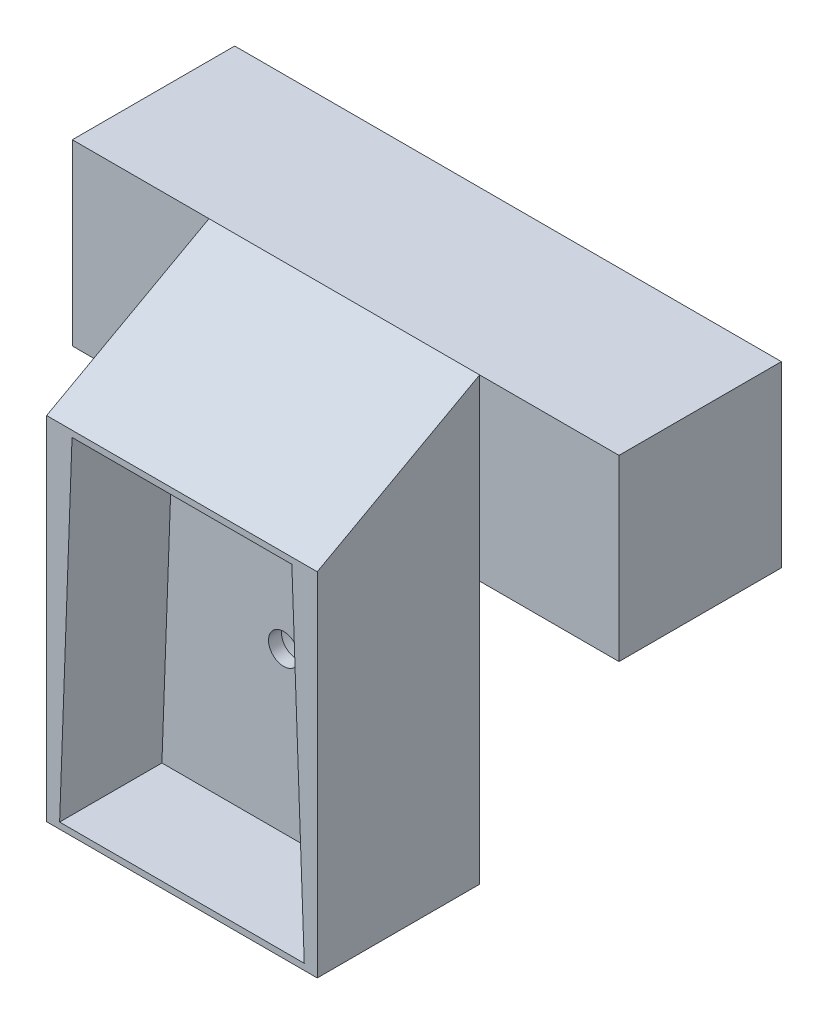
ISO-10303-21;
HEADER;
FILE_DESCRIPTION(('STEP AP214'),'2;1');
FILE_NAME('part.step','',(''),(''),'','','');
FILE_SCHEMA(('AUTOMOTIVE_DESIGN { 1 0 10303 214 1 1 1 1 }'));
ENDSEC;
DATA;
#1=APPLICATION_CONTEXT('core data for automotive mechanical design processes');
#2=APPLICATION_PROTOCOL_DEFINITION('international standard','automotive_design',2000,#1);
#3=PRODUCT_CONTEXT('',#1,'mechanical');
#4=PRODUCT('Part','Part','',(#3));
#5=PRODUCT_RELATED_PRODUCT_CATEGORY('part','',(#4));
#6=PRODUCT_DEFINITION_FORMATION('','',#4);
#7=PRODUCT_DEFINITION_CONTEXT('part definition',#1,'design');
#8=PRODUCT_DEFINITION('design','',#6,#7);
#9=PRODUCT_DEFINITION_SHAPE('','',#8);
#10=(LENGTH_UNIT() NAMED_UNIT(*) SI_UNIT(.MILLI.,.METRE.));
#11=(NAMED_UNIT(*) PLANE_ANGLE_UNIT() SI_UNIT($,.RADIAN.));
#12=(NAMED_UNIT(*) SI_UNIT($,.STERADIAN.) SOLID_ANGLE_UNIT());
#13=UNCERTAINTY_MEASURE_WITH_UNIT(LENGTH_MEASURE(1.E-05),#10,'distance_accuracy_value','');
#14=(GEOMETRIC_REPRESENTATION_CONTEXT(3) GLOBAL_UNCERTAINTY_ASSIGNED_CONTEXT((#13)) GLOBAL_UNIT_ASSIGNED_CONTEXT((#10,
#11,#12)) REPRESENTATION_CONTEXT('',''));
#15=CARTESIAN_POINT('',(0.,0.,0.));
#16=DIRECTION('',(0.,0.,1.));
#17=DIRECTION('',(1.,0.,0.));
#18=AXIS2_PLACEMENT_3D('',#15,#16,#17);
#19=CARTESIAN_POINT('',(0.,0.,60.));
#20=DIRECTION('',(0.,0.,1.));
#21=DIRECTION('',(1.,0.,0.));
#22=AXIS2_PLACEMENT_3D('',#19,#20,#21);
#23=PLANE('',#22);
#24=DIRECTION('',(0.,-1.,0.));
#25=VECTOR('',#24,1.);
#26=CARTESIAN_POINT('',(25.25,16.5,60.));
#27=LINE('',#26,#25);
#28=CARTESIAN_POINT('',(25.25,16.5,60.));
#29=VERTEX_POINT('',#28);
#30=CARTESIAN_POINT('',(25.25,-48.5,60.));
#31=VERTEX_POINT('',#30);
#32=EDGE_CURVE('E198',#29,#31,#27,.T.);
#33=ORIENTED_EDGE('',*,*,#32,.T.);
#34=DIRECTION('',(1.,0.,0.));
#35=VECTOR('',#34,1.);
#36=CARTESIAN_POINT('',(25.25,-48.5,60.));
#37=LINE('',#36,#35);
#38=CARTESIAN_POINT('',(75.25,-48.5,60.));
#39=VERTEX_POINT('',#38);
#40=EDGE_CURVE('E202',#31,#39,#37,.T.);
#41=ORIENTED_EDGE('',*,*,#40,.T.);
#42=DIRECTION('',(0.,-1.,0.));
#43=VECTOR('',#42,1.);
#44=CARTESIAN_POINT('',(75.25,16.5,60.));
#45=LINE('',#44,#43);
#46=CARTESIAN_POINT('',(75.25,16.5,60.));
#47=VERTEX_POINT('',#46);
#48=EDGE_CURVE('E206',#47,#39,#45,.T.);
#49=ORIENTED_EDGE('',*,*,#48,.F.);
#50=DIRECTION('',(1.,0.,0.));
#51=VECTOR('',#50,1.);
#52=CARTESIAN_POINT('',(25.25,16.5,60.));
#53=LINE('',#52,#51);
#54=EDGE_CURVE('E210',#29,#47,#53,.T.);
#55=ORIENTED_EDGE('',*,*,#54,.F.);
#56=EDGE_LOOP('',(#33,#41,#49,#55));
#57=FACE_BOUND('',#56,.T.);
#58=DIRECTION('',(0.0365783757071173,-0.999330787292491,0.));
#59=VECTOR('',#58,1.);
#60=CARTESIAN_POINT('',(70.555,15.35,60.));
#61=LINE('',#60,#59);
#62=CARTESIAN_POINT('',(70.555,15.35,60.));
#63=VERTEX_POINT('',#62);
#64=CARTESIAN_POINT('',(72.85,-47.35,60.));
#65=VERTEX_POINT('',#64);
#66=EDGE_CURVE('E165',#63,#65,#61,.T.);
#67=ORIENTED_EDGE('',*,*,#66,.T.);
#68=DIRECTION('',(-1.,0.,0.));
#69=VECTOR('',#68,1.);
#70=CARTESIAN_POINT('',(72.85,-47.35,60.));
#71=LINE('',#70,#69);
#72=CARTESIAN_POINT('',(27.65,-47.35,60.));
#73=VERTEX_POINT('',#72);
#74=EDGE_CURVE('E147',#65,#73,#71,.T.);
#75=ORIENTED_EDGE('',*,*,#74,.T.);
#76=DIRECTION('',(-0.0365783757071175,-0.999330787292491,0.));
#77=VECTOR('',#76,1.);
#78=CARTESIAN_POINT('',(29.945,15.35,60.));
#79=LINE('',#78,#77);
#80=CARTESIAN_POINT('',(29.945,15.35,60.));
#81=VERTEX_POINT('',#80);
#82=EDGE_CURVE('E157',#81,#73,#79,.T.);
#83=ORIENTED_EDGE('',*,*,#82,.F.);
#84=DIRECTION('',(1.,0.,0.));
#85=VECTOR('',#84,1.);
#86=CARTESIAN_POINT('',(29.945,15.35,60.));
#87=LINE('',#86,#85);
#88=EDGE_CURVE('E60',#81,#63,#87,.T.);
#89=ORIENTED_EDGE('',*,*,#88,.T.);
#90=EDGE_LOOP('',(#67,#75,#83,#89));
#91=FACE_BOUND('',#90,.T.);
#92=ADVANCED_FACE('F43',(#57,#91),#23,.T.);
#93=CARTESIAN_POINT('',(0.,0.,30.));
#94=DIRECTION('',(0.,0.,-1.));
#95=DIRECTION('',(-1.,0.,0.));
#96=AXIS2_PLACEMENT_3D('',#93,#94,#95);
#97=PLANE('',#96);
#98=DIRECTION('',(-1.,0.,0.));
#99=VECTOR('',#98,1.);
#100=CARTESIAN_POINT('',(0.,33.,30.));
#101=LINE('',#100,#99);
#102=CARTESIAN_POINT('',(101.,33.,30.));
#103=VERTEX_POINT('',#102);
#104=CARTESIAN_POINT('',(75.25,33.,30.));
#105=VERTEX_POINT('',#104);
#106=EDGE_CURVE('E247',#103,#105,#101,.T.);
#107=ORIENTED_EDGE('',*,*,#106,.T.);
#108=DIRECTION('',(0.,-1.,0.));
#109=VECTOR('',#108,1.);
#110=CARTESIAN_POINT('',(75.25,16.5,30.));
#111=LINE('',#110,#109);
#112=CARTESIAN_POINT('',(75.25,0.,30.));
#113=VERTEX_POINT('',#112);
#114=EDGE_CURVE('E203',#105,#113,#111,.T.);
#115=ORIENTED_EDGE('',*,*,#114,.T.);
#116=DIRECTION('',(1.,0.,0.));
#117=VECTOR('',#116,1.);
#118=CARTESIAN_POINT('',(0.,0.,30.));
#119=LINE('',#118,#117);
#120=CARTESIAN_POINT('',(101.,0.,30.));
#121=VERTEX_POINT('',#120);
#122=EDGE_CURVE('E237',#113,#121,#119,.T.);
#123=ORIENTED_EDGE('',*,*,#122,.T.);
#124=DIRECTION('',(0.,1.,0.));
#125=VECTOR('',#124,1.);
#126=CARTESIAN_POINT('',(101.,0.,30.));
#127=LINE('',#126,#125);
#128=EDGE_CURVE('E242',#121,#103,#127,.T.);
#129=ORIENTED_EDGE('',*,*,#128,.T.);
#130=EDGE_LOOP('',(#107,#115,#123,#129));
#131=FACE_BOUND('',#130,.T.);
#132=ADVANCED_FACE('F336',(#131),#97,.F.);
#133=DIRECTION('',(0.,-1.,0.));
#134=VECTOR('',#133,1.);
#135=CARTESIAN_POINT('',(25.25,16.5,30.));
#136=LINE('',#135,#134);
#137=CARTESIAN_POINT('',(25.25,33.,30.));
#138=VERTEX_POINT('',#137);
#139=CARTESIAN_POINT('',(25.25,0.,30.));
#140=VERTEX_POINT('',#139);
#141=EDGE_CURVE('E68',#138,#140,#136,.T.);
#142=ORIENTED_EDGE('',*,*,#141,.F.);
#143=CARTESIAN_POINT('',(0.,33.,30.));
#144=VERTEX_POINT('',#143);
#145=EDGE_CURVE('E246',#138,#144,#101,.T.);
#146=ORIENTED_EDGE('',*,*,#145,.T.);
#147=DIRECTION('',(0.,-1.,0.));
#148=VECTOR('',#147,1.);
#149=CARTESIAN_POINT('',(0.,0.,30.));
#150=LINE('',#149,#148);
#151=CARTESIAN_POINT('',(0.,0.,30.));
#152=VERTEX_POINT('',#151);
#153=EDGE_CURVE('E233',#144,#152,#150,.T.);
#154=ORIENTED_EDGE('',*,*,#153,.T.);
#155=EDGE_CURVE('E239',#152,#140,#119,.T.);
#156=ORIENTED_EDGE('',*,*,#155,.T.);
#157=EDGE_LOOP('',(#142,#146,#154,#156));
#158=FACE_BOUND('',#157,.T.);
#159=ADVANCED_FACE('F291',(#158),#97,.F.);
#160=CARTESIAN_POINT('',(0.,0.,30.));
#161=DIRECTION('',(1.,0.,0.));
#162=DIRECTION('',(0.,0.,-1.));
#163=AXIS2_PLACEMENT_3D('',#160,#161,#162);
#164=PLANE('',#163);
#165=DIRECTION('',(0.,-1.,0.));
#166=VECTOR('',#165,1.);
#167=CARTESIAN_POINT('',(0.,0.,0.));
#168=LINE('',#167,#166);
#169=CARTESIAN_POINT('',(0.,33.,0.));
#170=VERTEX_POINT('',#169);
#171=CARTESIAN_POINT('',(0.,0.,0.));
#172=VERTEX_POINT('',#171);
#173=EDGE_CURVE('E232',#170,#172,#168,.T.);
#174=ORIENTED_EDGE('',*,*,#173,.T.);
#175=DIRECTION('',(0.,0.,-1.));
#176=VECTOR('',#175,1.);
#177=CARTESIAN_POINT('',(0.,0.,30.));
#178=LINE('',#177,#176);
#179=EDGE_CURVE('E12',#152,#172,#178,.T.);
#180=ORIENTED_EDGE('',*,*,#179,.F.);
#181=ORIENTED_EDGE('',*,*,#153,.F.);
#182=DIRECTION('',(0.,0.,-1.));
#183=VECTOR('',#182,1.);
#184=CARTESIAN_POINT('',(0.,33.,30.));
#185=LINE('',#184,#183);
#186=EDGE_CURVE('E251',#144,#170,#185,.T.);
#187=ORIENTED_EDGE('',*,*,#186,.T.);
#188=EDGE_LOOP('',(#174,#180,#181,#187));
#189=FACE_BOUND('',#188,.T.);
#190=ADVANCED_FACE('F45',(#189),#164,.F.);
#191=CARTESIAN_POINT('',(0.,0.,30.));
#192=DIRECTION('',(0.,1.,0.));
#193=DIRECTION('',(0.,0.,1.));
#194=AXIS2_PLACEMENT_3D('',#191,#192,#193);
#195=PLANE('',#194);
#196=DIRECTION('',(1.,0.,0.));
#197=VECTOR('',#196,1.);
#198=CARTESIAN_POINT('',(0.,0.,0.));
#199=LINE('',#198,#197);
#200=CARTESIAN_POINT('',(101.,0.,0.));
#201=VERTEX_POINT('',#200);
#202=EDGE_CURVE('E255',#172,#201,#199,.T.);
#203=ORIENTED_EDGE('',*,*,#202,.T.);
#204=DIRECTION('',(0.,0.,-1.));
#205=VECTOR('',#204,1.);
#206=CARTESIAN_POINT('',(101.,0.,30.));
#207=LINE('',#206,#205);
#208=EDGE_CURVE('E53',#121,#201,#207,.T.);
#209=ORIENTED_EDGE('',*,*,#208,.F.);
#210=ORIENTED_EDGE('',*,*,#122,.F.);
#211=EDGE_CURVE('E243',#140,#113,#119,.T.);
#212=ORIENTED_EDGE('',*,*,#211,.F.);
#213=ORIENTED_EDGE('',*,*,#155,.F.);
#214=ORIENTED_EDGE('',*,*,#179,.T.);
#215=EDGE_LOOP('',(#203,#209,#210,#212,#213,#214));
#216=FACE_BOUND('',#215,.T.);
#217=ADVANCED_FACE('F334',(#216),#195,.F.);
#218=CARTESIAN_POINT('',(101.,0.,30.));
#219=DIRECTION('',(-1.,0.,0.));
#220=DIRECTION('',(0.,0.,1.));
#221=AXIS2_PLACEMENT_3D('',#218,#219,#220);
#222=PLANE('',#221);
#223=DIRECTION('',(0.,1.,0.));
#224=VECTOR('',#223,1.);
#225=CARTESIAN_POINT('',(101.,0.,0.));
#226=LINE('',#225,#224);
#227=CARTESIAN_POINT('',(101.,33.,0.));
#228=VERTEX_POINT('',#227);
#229=EDGE_CURVE('E258',#201,#228,#226,.T.);
#230=ORIENTED_EDGE('',*,*,#229,.T.);
#231=DIRECTION('',(0.,0.,-1.));
#232=VECTOR('',#231,1.);
#233=CARTESIAN_POINT('',(101.,33.,30.));
#234=LINE('',#233,#232);
#235=EDGE_CURVE('E266',#103,#228,#234,.T.);
#236=ORIENTED_EDGE('',*,*,#235,.F.);
#237=ORIENTED_EDGE('',*,*,#128,.F.);
#238=ORIENTED_EDGE('',*,*,#208,.T.);
#239=EDGE_LOOP('',(#230,#236,#237,#238));
#240=FACE_BOUND('',#239,.T.);
#241=ADVANCED_FACE('F276',(#240),#222,.F.);
#242=CARTESIAN_POINT('',(0.,33.,30.));
#243=DIRECTION('',(0.,-1.,0.));
#244=DIRECTION('',(0.,0.,-1.));
#245=AXIS2_PLACEMENT_3D('',#242,#243,#244);
#246=PLANE('',#245);
#247=DIRECTION('',(-1.,0.,0.));
#248=VECTOR('',#247,1.);
#249=CARTESIAN_POINT('',(0.,33.,0.));
#250=LINE('',#249,#248);
#251=EDGE_CURVE('E238',#228,#170,#250,.T.);
#252=ORIENTED_EDGE('',*,*,#251,.T.);
#253=ORIENTED_EDGE('',*,*,#186,.F.);
#254=ORIENTED_EDGE('',*,*,#145,.F.);
#255=DIRECTION('',(-1.,0.,0.));
#256=VECTOR('',#255,1.);
#257=CARTESIAN_POINT('',(75.25,33.,30.));
#258=LINE('',#257,#256);
#259=EDGE_CURVE('E188',#105,#138,#258,.T.);
#260=ORIENTED_EDGE('',*,*,#259,.F.);
#261=ORIENTED_EDGE('',*,*,#106,.F.);
#262=ORIENTED_EDGE('',*,*,#235,.T.);
#263=EDGE_LOOP('',(#252,#253,#254,#260,#261,#262));
#264=FACE_BOUND('',#263,.T.);
#265=ADVANCED_FACE('F286',(#264),#246,.F.);
#266=CARTESIAN_POINT('',(0.,0.,0.));
#267=DIRECTION('',(0.,0.,-1.));
#268=DIRECTION('',(-1.,0.,0.));
#269=AXIS2_PLACEMENT_3D('',#266,#267,#268);
#270=PLANE('',#269);
#271=ORIENTED_EDGE('',*,*,#173,.F.);
#272=ORIENTED_EDGE('',*,*,#251,.F.);
#273=ORIENTED_EDGE('',*,*,#229,.F.);
#274=ORIENTED_EDGE('',*,*,#202,.F.);
#275=EDGE_LOOP('',(#271,#272,#273,#274));
#276=FACE_BOUND('',#275,.T.);
#277=ADVANCED_FACE('F283',(#276),#270,.T.);
#278=CARTESIAN_POINT('',(0.,0.,30.));
#279=DIRECTION('',(0.,0.,1.));
#280=DIRECTION('',(1.,0.,0.));
#281=AXIS2_PLACEMENT_3D('',#278,#279,#280);
#282=PLANE('',#281);
#283=CARTESIAN_POINT('',(50.1441154312507,-17.85,30.));
#284=DIRECTION('',(0.,0.,-1.));
#285=DIRECTION('',(-1.,0.,0.));
#286=AXIS2_PLACEMENT_3D('',#283,#284,#285);
#287=CIRCLE('',#286,7.5);
#288=CARTESIAN_POINT('',(42.6441154312507,-17.85,30.));
#289=VERTEX_POINT('',#288);
#290=EDGE_CURVE('E316',#289,#289,#287,.T.);
#291=ORIENTED_EDGE('',*,*,#290,.F.);
#292=EDGE_LOOP('',(#291));
#293=FACE_BOUND('',#292,.T.);
#294=CARTESIAN_POINT('',(25.25,-48.5,30.));
#295=VERTEX_POINT('',#294);
#296=EDGE_CURVE('E197',#140,#295,#136,.T.);
#297=ORIENTED_EDGE('',*,*,#296,.F.);
#298=ORIENTED_EDGE('',*,*,#211,.T.);
#299=CARTESIAN_POINT('',(75.25,-48.5,30.));
#300=VERTEX_POINT('',#299);
#301=EDGE_CURVE('E221',#113,#300,#111,.T.);
#302=ORIENTED_EDGE('',*,*,#301,.T.);
#303=DIRECTION('',(1.,0.,0.));
#304=VECTOR('',#303,1.);
#305=CARTESIAN_POINT('',(25.25,-48.5,30.));
#306=LINE('',#305,#304);
#307=EDGE_CURVE('E217',#295,#300,#306,.T.);
#308=ORIENTED_EDGE('',*,*,#307,.F.);
#309=EDGE_LOOP('',(#297,#298,#302,#308));
#310=FACE_BOUND('',#309,.T.);
#311=ADVANCED_FACE('F324',(#293,#310),#282,.F.);
#312=CARTESIAN_POINT('',(25.25,16.5,60.));
#313=DIRECTION('',(1.,0.,0.));
#314=DIRECTION('',(0.,1.,0.));
#315=AXIS2_PLACEMENT_3D('',#312,#313,#314);
#316=PLANE('',#315);
#317=ORIENTED_EDGE('',*,*,#141,.T.);
#318=ORIENTED_EDGE('',*,*,#296,.T.);
#319=DIRECTION('',(0.,0.,-1.));
#320=VECTOR('',#319,1.);
#321=CARTESIAN_POINT('',(25.25,-48.5,60.));
#322=LINE('',#321,#320);
#323=EDGE_CURVE('E228',#31,#295,#322,.T.);
#324=ORIENTED_EDGE('',*,*,#323,.F.);
#325=ORIENTED_EDGE('',*,*,#32,.F.);
#326=DIRECTION('',(0.,0.481918749772156,-0.876215908676647));
#327=VECTOR('',#326,1.);
#328=CARTESIAN_POINT('',(25.25,33.,30.));
#329=LINE('',#328,#327);
#330=EDGE_CURVE('E189',#29,#138,#329,.T.);
#331=ORIENTED_EDGE('',*,*,#330,.T.);
#332=EDGE_LOOP('',(#317,#318,#324,#325,#331));
#333=FACE_BOUND('',#332,.T.);
#334=ADVANCED_FACE('F327',(#333),#316,.F.);
#335=CARTESIAN_POINT('',(25.25,-48.5,60.));
#336=DIRECTION('',(0.,1.,0.));
#337=DIRECTION('',(0.,0.,1.));
#338=AXIS2_PLACEMENT_3D('',#335,#336,#337);
#339=PLANE('',#338);
#340=ORIENTED_EDGE('',*,*,#307,.T.);
#341=DIRECTION('',(0.,0.,-1.));
#342=VECTOR('',#341,1.);
#343=CARTESIAN_POINT('',(75.25,-48.5,60.));
#344=LINE('',#343,#342);
#345=EDGE_CURVE('E214',#39,#300,#344,.T.);
#346=ORIENTED_EDGE('',*,*,#345,.F.);
#347=ORIENTED_EDGE('',*,*,#40,.F.);
#348=ORIENTED_EDGE('',*,*,#323,.T.);
#349=EDGE_LOOP('',(#340,#346,#347,#348));
#350=FACE_BOUND('',#349,.T.);
#351=ADVANCED_FACE('F346',(#350),#339,.F.);
#352=CARTESIAN_POINT('',(75.25,16.5,60.));
#353=DIRECTION('',(1.,0.,0.));
#354=DIRECTION('',(0.,1.,0.));
#355=AXIS2_PLACEMENT_3D('',#352,#353,#354);
#356=PLANE('',#355);
#357=ORIENTED_EDGE('',*,*,#114,.F.);
#358=DIRECTION('',(0.,0.481918749772156,-0.876215908676647));
#359=VECTOR('',#358,1.);
#360=CARTESIAN_POINT('',(75.25,33.,30.));
#361=LINE('',#360,#359);
#362=EDGE_CURVE('E184',#47,#105,#361,.T.);
#363=ORIENTED_EDGE('',*,*,#362,.F.);
#364=ORIENTED_EDGE('',*,*,#48,.T.);
#365=ORIENTED_EDGE('',*,*,#345,.T.);
#366=ORIENTED_EDGE('',*,*,#301,.F.);
#367=EDGE_LOOP('',(#357,#363,#364,#365,#366));
#368=FACE_BOUND('',#367,.T.);
#369=ADVANCED_FACE('F339',(#368),#356,.T.);
#370=CARTESIAN_POINT('',(75.25,33.,30.));
#371=DIRECTION('',(0.,0.876215908676647,0.481918749772156));
#372=DIRECTION('',(0.,-0.481918749772156,0.876215908676647));
#373=AXIS2_PLACEMENT_3D('',#370,#371,#372);
#374=PLANE('',#373);
#375=ORIENTED_EDGE('',*,*,#330,.F.);
#376=ORIENTED_EDGE('',*,*,#54,.T.);
#377=ORIENTED_EDGE('',*,*,#362,.T.);
#378=ORIENTED_EDGE('',*,*,#259,.T.);
#379=EDGE_LOOP('',(#375,#376,#377,#378));
#380=FACE_BOUND('',#379,.T.);
#381=ADVANCED_FACE('F341',(#380),#374,.T.);
#382=CARTESIAN_POINT('',(72.85,-47.35,-55.093790177478));
#383=DIRECTION('',(0.,1.,0.));
#384=DIRECTION('',(0.,0.,1.));
#385=AXIS2_PLACEMENT_3D('',#382,#383,#384);
#386=PLANE('',#385);
#387=DIRECTION('',(0.,0.,1.));
#388=VECTOR('',#387,1.);
#389=CARTESIAN_POINT('',(27.65,-47.35,-55.093790177478));
#390=LINE('',#389,#388);
#391=CARTESIAN_POINT('',(27.65,-47.35,41.1));
#392=VERTEX_POINT('',#391);
#393=EDGE_CURVE('E142',#392,#73,#390,.T.);
#394=ORIENTED_EDGE('',*,*,#393,.T.);
#395=ORIENTED_EDGE('',*,*,#74,.F.);
#396=DIRECTION('',(0.,0.,1.));
#397=VECTOR('',#396,1.);
#398=CARTESIAN_POINT('',(72.85,-47.35,-55.093790177478));
#399=LINE('',#398,#397);
#400=CARTESIAN_POINT('',(72.85,-47.35,41.1));
#401=VERTEX_POINT('',#400);
#402=EDGE_CURVE('E154',#401,#65,#399,.T.);
#403=ORIENTED_EDGE('',*,*,#402,.F.);
#404=DIRECTION('',(1.,0.,0.));
#405=VECTOR('',#404,1.);
#406=CARTESIAN_POINT('',(72.85,-47.35,41.1));
#407=LINE('',#406,#405);
#408=EDGE_CURVE('E150',#392,#401,#407,.T.);
#409=ORIENTED_EDGE('',*,*,#408,.F.);
#410=EDGE_LOOP('',(#394,#395,#403,#409));
#411=FACE_BOUND('',#410,.T.);
#412=ADVANCED_FACE('F144',(#411),#386,.T.);
#413=CARTESIAN_POINT('',(70.555,15.35,-55.093790177478));
#414=DIRECTION('',(-0.99933078729249,-0.0365783757071173,0.));
#415=DIRECTION('',(0.0365783757071173,-0.999330787292491,0.));
#416=AXIS2_PLACEMENT_3D('',#413,#414,#415);
#417=PLANE('',#416);
#418=ORIENTED_EDGE('',*,*,#402,.T.);
#419=ORIENTED_EDGE('',*,*,#66,.F.);
#420=DIRECTION('',(0.,0.,1.));
#421=VECTOR('',#420,1.);
#422=CARTESIAN_POINT('',(70.555,15.35,-55.093790177478));
#423=LINE('',#422,#421);
#424=CARTESIAN_POINT('',(70.555,15.35,41.1));
#425=VERTEX_POINT('',#424);
#426=EDGE_CURVE('E176',#425,#63,#423,.T.);
#427=ORIENTED_EDGE('',*,*,#426,.F.);
#428=DIRECTION('',(-0.0365783757071173,0.999330787292491,0.));
#429=VECTOR('',#428,1.);
#430=CARTESIAN_POINT('',(70.555,15.35,41.1));
#431=LINE('',#430,#429);
#432=EDGE_CURVE('E183',#401,#425,#431,.T.);
#433=ORIENTED_EDGE('',*,*,#432,.F.);
#434=EDGE_LOOP('',(#418,#419,#427,#433));
#435=FACE_BOUND('',#434,.T.);
#436=ADVANCED_FACE('F370',(#435),#417,.T.);
#437=CARTESIAN_POINT('',(29.945,15.35,-55.093790177478));
#438=DIRECTION('',(0.,-1.,0.));
#439=DIRECTION('',(1.,0.,0.));
#440=AXIS2_PLACEMENT_3D('',#437,#438,#439);
#441=PLANE('',#440);
#442=ORIENTED_EDGE('',*,*,#426,.T.);
#443=ORIENTED_EDGE('',*,*,#88,.F.);
#444=DIRECTION('',(0.,0.,1.));
#445=VECTOR('',#444,1.);
#446=CARTESIAN_POINT('',(29.945,15.35,-55.093790177478));
#447=LINE('',#446,#445);
#448=CARTESIAN_POINT('',(29.945,15.35,41.1));
#449=VERTEX_POINT('',#448);
#450=EDGE_CURVE('E159',#449,#81,#447,.T.);
#451=ORIENTED_EDGE('',*,*,#450,.F.);
#452=DIRECTION('',(-1.,0.,0.));
#453=VECTOR('',#452,1.);
#454=CARTESIAN_POINT('',(29.945,15.35,41.1));
#455=LINE('',#454,#453);
#456=EDGE_CURVE('E301',#425,#449,#455,.T.);
#457=ORIENTED_EDGE('',*,*,#456,.F.);
#458=EDGE_LOOP('',(#442,#443,#451,#457));
#459=FACE_BOUND('',#458,.T.);
#460=ADVANCED_FACE('F367',(#459),#441,.T.);
#461=CARTESIAN_POINT('',(29.945,15.35,-55.093790177478));
#462=DIRECTION('',(-0.99933078729249,0.0365783757071175,0.));
#463=DIRECTION('',(-0.0365783757071175,-0.999330787292491,0.));
#464=AXIS2_PLACEMENT_3D('',#461,#462,#463);
#465=PLANE('',#464);
#466=DIRECTION('',(0.0365783757071175,0.999330787292491,0.));
#467=VECTOR('',#466,1.);
#468=CARTESIAN_POINT('',(29.945,15.35,41.1));
#469=LINE('',#468,#467);
#470=EDGE_CURVE('E193',#392,#449,#469,.T.);
#471=ORIENTED_EDGE('',*,*,#470,.T.);
#472=ORIENTED_EDGE('',*,*,#450,.T.);
#473=ORIENTED_EDGE('',*,*,#82,.T.);
#474=ORIENTED_EDGE('',*,*,#393,.F.);
#475=EDGE_LOOP('',(#471,#472,#473,#474));
#476=FACE_BOUND('',#475,.T.);
#477=ADVANCED_FACE('F158',(#476),#465,.F.);
#478=CARTESIAN_POINT('',(0.,0.,41.1));
#479=DIRECTION('',(0.,0.,1.));
#480=DIRECTION('',(1.,0.,0.));
#481=AXIS2_PLACEMENT_3D('',#478,#479,#480);
#482=PLANE('',#481);
#483=CARTESIAN_POINT('',(50.1441154312507,-17.85,41.1));
#484=DIRECTION('',(0.,0.,1.));
#485=DIRECTION('',(1.,0.,0.));
#486=AXIS2_PLACEMENT_3D('',#483,#484,#485);
#487=CIRCLE('',#486,2.8);
#488=CARTESIAN_POINT('',(52.9441154312507,-17.85,41.1));
#489=VERTEX_POINT('',#488);
#490=EDGE_CURVE('E162',#489,#489,#487,.T.);
#491=ORIENTED_EDGE('',*,*,#490,.F.);
#492=EDGE_LOOP('',(#491));
#493=FACE_BOUND('',#492,.T.);
#494=ORIENTED_EDGE('',*,*,#470,.F.);
#495=ORIENTED_EDGE('',*,*,#408,.T.);
#496=ORIENTED_EDGE('',*,*,#432,.T.);
#497=ORIENTED_EDGE('',*,*,#456,.T.);
#498=EDGE_LOOP('',(#494,#495,#496,#497));
#499=FACE_BOUND('',#498,.T.);
#500=ADVANCED_FACE('F366',(#493,#499),#482,.T.);
#501=CARTESIAN_POINT('',(50.1441154312507,-17.85,4.78040405071071));
#502=DIRECTION('',(0.,0.,1.));
#503=DIRECTION('',(1.,0.,0.));
#504=AXIS2_PLACEMENT_3D('',#501,#502,#503);
#505=CYLINDRICAL_SURFACE('',#504,2.8);
#506=CARTESIAN_POINT('',(50.1441154312507,-17.85,38.7));
#507=DIRECTION('',(0.,0.,1.));
#508=DIRECTION('',(1.,0.,0.));
#509=AXIS2_PLACEMENT_3D('',#506,#507,#508);
#510=CIRCLE('',#509,2.8);
#511=CARTESIAN_POINT('',(52.9441154312507,-17.85,38.7));
#512=VERTEX_POINT('',#511);
#513=EDGE_CURVE('E47',#512,#512,#510,.F.);
#514=ORIENTED_EDGE('',*,*,#513,.T.);
#515=EDGE_LOOP('',(#514));
#516=FACE_BOUND('',#515,.T.);
#517=ORIENTED_EDGE('',*,*,#490,.T.);
#518=EDGE_LOOP('',(#517));
#519=FACE_BOUND('',#518,.T.);
#520=ADVANCED_FACE('F378',(#516,#519),#505,.F.);
#521=CARTESIAN_POINT('',(0.,0.,38.7));
#522=DIRECTION('',(0.,0.,1.));
#523=DIRECTION('',(1.,0.,0.));
#524=AXIS2_PLACEMENT_3D('',#521,#522,#523);
#525=PLANE('',#524);
#526=CARTESIAN_POINT('',(50.1441154312507,-17.85,38.7));
#527=DIRECTION('',(0.,0.,1.));
#528=DIRECTION('',(1.,0.,0.));
#529=AXIS2_PLACEMENT_3D('',#526,#527,#528);
#530=CIRCLE('',#529,7.5);
#531=CARTESIAN_POINT('',(57.6441154312507,-17.85,38.7));
#532=VERTEX_POINT('',#531);
#533=EDGE_CURVE('E312',#532,#532,#530,.F.);
#534=ORIENTED_EDGE('',*,*,#533,.T.);
#535=EDGE_LOOP('',(#534));
#536=FACE_BOUND('',#535,.T.);
#537=ORIENTED_EDGE('',*,*,#513,.F.);
#538=EDGE_LOOP('',(#537));
#539=FACE_BOUND('',#538,.T.);
#540=ADVANCED_FACE('F382',(#536,#539),#525,.F.);
#541=CARTESIAN_POINT('',(50.1441154312507,-17.85,68.6132034355964));
#542=DIRECTION('',(0.,0.,-1.));
#543=DIRECTION('',(-1.,0.,0.));
#544=AXIS2_PLACEMENT_3D('',#541,#542,#543);
#545=CYLINDRICAL_SURFACE('',#544,7.5);
#546=ORIENTED_EDGE('',*,*,#290,.T.);
#547=EDGE_LOOP('',(#546));
#548=FACE_BOUND('',#547,.T.);
#549=ORIENTED_EDGE('',*,*,#533,.F.);
#550=EDGE_LOOP('',(#549));
#551=FACE_BOUND('',#550,.T.);
#552=ADVANCED_FACE('F321',(#548,#551),#545,.F.);
#553=CLOSED_SHELL('',(#92,#132,#159,#190,#217,#241,#265,#277,#311,#334,#351,#369,#381,#412,#436,
#460,#477,#500,#520,#540,#552));
#554=MANIFOLD_SOLID_BREP('B2',#553);
#555=ADVANCED_BREP_SHAPE_REPRESENTATION('',(#18,#554),#14);
#556=SHAPE_DEFINITION_REPRESENTATION(#9,#555);
ENDSEC;
END-ISO-10303-21;
